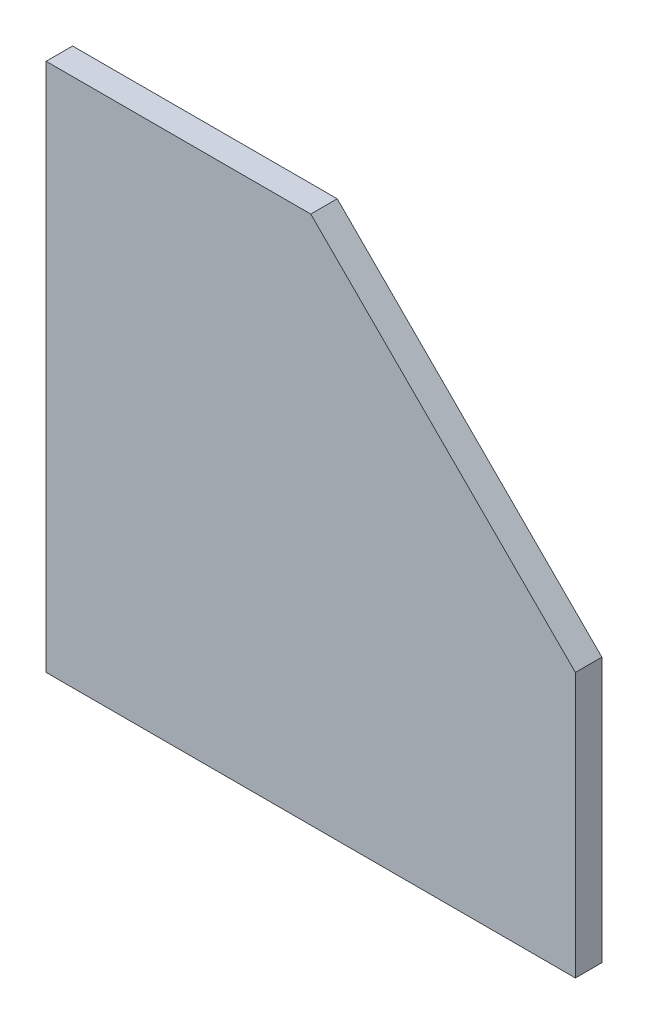
ISO-10303-21;
HEADER;
FILE_DESCRIPTION(('STEP AP214'),'2;1');
FILE_NAME('part.step','',(''),(''),'','','');
FILE_SCHEMA(('AUTOMOTIVE_DESIGN { 1 0 10303 214 1 1 1 1 }'));
ENDSEC;
DATA;
#1=APPLICATION_CONTEXT('core data for automotive mechanical design processes');
#2=APPLICATION_PROTOCOL_DEFINITION('international standard','automotive_design',2000,#1);
#3=PRODUCT_CONTEXT('',#1,'mechanical');
#4=PRODUCT('Part','Part','',(#3));
#5=PRODUCT_RELATED_PRODUCT_CATEGORY('part','',(#4));
#6=PRODUCT_DEFINITION_FORMATION('','',#4);
#7=PRODUCT_DEFINITION_CONTEXT('part definition',#1,'design');
#8=PRODUCT_DEFINITION('design','',#6,#7);
#9=PRODUCT_DEFINITION_SHAPE('','',#8);
#10=(LENGTH_UNIT() NAMED_UNIT(*) SI_UNIT(.MILLI.,.METRE.));
#11=(NAMED_UNIT(*) PLANE_ANGLE_UNIT() SI_UNIT($,.RADIAN.));
#12=(NAMED_UNIT(*) SI_UNIT($,.STERADIAN.) SOLID_ANGLE_UNIT());
#13=UNCERTAINTY_MEASURE_WITH_UNIT(LENGTH_MEASURE(1.E-05),#10,'distance_accuracy_value','');
#14=(GEOMETRIC_REPRESENTATION_CONTEXT(3) GLOBAL_UNCERTAINTY_ASSIGNED_CONTEXT((#13)) GLOBAL_UNIT_ASSIGNED_CONTEXT((#10,
#11,#12)) REPRESENTATION_CONTEXT('',''));
#15=CARTESIAN_POINT('',(0.,0.,0.));
#16=DIRECTION('',(0.,0.,1.));
#17=DIRECTION('',(1.,0.,0.));
#18=AXIS2_PLACEMENT_3D('',#15,#16,#17);
#19=CARTESIAN_POINT('',(-568.48934761149,-611.90552333629,-812.486147986318));
#20=DIRECTION('',(0.,0.,-1.));
#21=DIRECTION('',(-1.,0.,0.));
#22=AXIS2_PLACEMENT_3D('',#19,#20,#21);
#23=PLANE('',#22);
#24=DIRECTION('',(0.,1.,0.));
#25=VECTOR('',#24,1.);
#26=CARTESIAN_POINT('',(-628.489347611488,-611.90552333629,-812.486147986318));
#27=LINE('',#26,#25);
#28=CARTESIAN_POINT('',(-628.489347611488,-551.905523336291,-812.486147986318));
#29=VERTEX_POINT('',#28);
#30=CARTESIAN_POINT('',(-628.489347611488,-671.905523336291,-812.486147986318));
#31=VERTEX_POINT('',#30);
#32=EDGE_CURVE('E91',#29,#31,#27,.F.);
#33=ORIENTED_EDGE('',*,*,#32,.F.);
#34=DIRECTION('',(1.,0.,0.));
#35=VECTOR('',#34,1.);
#36=CARTESIAN_POINT('',(-568.48934761149,-551.905523336291,-812.486147986318));
#37=LINE('',#36,#35);
#38=CARTESIAN_POINT('',(-568.489347611487,-551.905523336291,-812.486147986318));
#39=VERTEX_POINT('',#38);
#40=EDGE_CURVE('E94',#39,#29,#37,.F.);
#41=ORIENTED_EDGE('',*,*,#40,.F.);
#42=DIRECTION('',(0.707106781186548,-0.707106781186548,0.));
#43=VECTOR('',#42,1.);
#44=CARTESIAN_POINT('',(-538.489347611488,-581.90552333629,-812.486147986318));
#45=LINE('',#44,#43);
#46=CARTESIAN_POINT('',(-508.489347611488,-611.90552333629,-812.486147986318));
#47=VERTEX_POINT('',#46);
#48=EDGE_CURVE('E66',#39,#47,#45,.T.);
#49=ORIENTED_EDGE('',*,*,#48,.T.);
#50=DIRECTION('',(0.,1.,0.));
#51=VECTOR('',#50,1.);
#52=CARTESIAN_POINT('',(-508.489347611488,-611.90552333629,-812.486147986318));
#53=LINE('',#52,#51);
#54=CARTESIAN_POINT('',(-508.489347611488,-671.905523336291,-812.486147986318));
#55=VERTEX_POINT('',#54);
#56=EDGE_CURVE('E20',#55,#47,#53,.T.);
#57=ORIENTED_EDGE('',*,*,#56,.F.);
#58=DIRECTION('',(1.,0.,0.));
#59=VECTOR('',#58,1.);
#60=CARTESIAN_POINT('',(-568.48934761149,-671.905523336291,-812.486147986318));
#61=LINE('',#60,#59);
#62=EDGE_CURVE('E63',#31,#55,#61,.T.);
#63=ORIENTED_EDGE('',*,*,#62,.F.);
#64=EDGE_LOOP('',(#33,#41,#49,#57,#63));
#65=FACE_BOUND('',#64,.T.);
#66=ADVANCED_FACE('F17',(#65),#23,.T.);
#67=CARTESIAN_POINT('',(-508.489347611488,-611.90552333629,-809.486147986318));
#68=DIRECTION('',(1.,0.,0.));
#69=DIRECTION('',(0.,0.,-1.));
#70=AXIS2_PLACEMENT_3D('',#67,#68,#69);
#71=PLANE('',#70);
#72=DIRECTION('',(0.,0.,-1.));
#73=VECTOR('',#72,1.);
#74=CARTESIAN_POINT('',(-508.489347611488,-671.905523336291,-809.486147986318));
#75=LINE('',#74,#73);
#76=CARTESIAN_POINT('',(-508.489347611488,-671.905523336291,-806.48614798632));
#77=VERTEX_POINT('',#76);
#78=EDGE_CURVE('E72',#55,#77,#75,.F.);
#79=ORIENTED_EDGE('',*,*,#78,.F.);
#80=ORIENTED_EDGE('',*,*,#56,.T.);
#81=DIRECTION('',(0.,0.,1.));
#82=VECTOR('',#81,1.);
#83=CARTESIAN_POINT('',(-508.489347611488,-611.90552333629,-809.486147986318));
#84=LINE('',#83,#82);
#85=CARTESIAN_POINT('',(-508.489347611488,-611.90552333629,-806.48614798632));
#86=VERTEX_POINT('',#85);
#87=EDGE_CURVE('E100',#47,#86,#84,.T.);
#88=ORIENTED_EDGE('',*,*,#87,.T.);
#89=DIRECTION('',(0.,1.,0.));
#90=VECTOR('',#89,1.);
#91=CARTESIAN_POINT('',(-508.489347611488,-611.90552333629,-806.48614798632));
#92=LINE('',#91,#90);
#93=EDGE_CURVE('E83',#86,#77,#92,.F.);
#94=ORIENTED_EDGE('',*,*,#93,.T.);
#95=EDGE_LOOP('',(#79,#80,#88,#94));
#96=FACE_BOUND('',#95,.T.);
#97=ADVANCED_FACE('F82',(#96),#71,.T.);
#98=CARTESIAN_POINT('',(-568.48934761149,-671.905523336291,-809.486147986318));
#99=DIRECTION('',(0.,-1.,0.));
#100=DIRECTION('',(0.,0.,-1.));
#101=AXIS2_PLACEMENT_3D('',#98,#99,#100);
#102=PLANE('',#101);
#103=DIRECTION('',(0.,0.,1.));
#104=VECTOR('',#103,1.);
#105=CARTESIAN_POINT('',(-628.489347611488,-671.905523336291,-809.486147986318));
#106=LINE('',#105,#104);
#107=CARTESIAN_POINT('',(-628.489347611488,-671.905523336291,-806.48614798632));
#108=VERTEX_POINT('',#107);
#109=EDGE_CURVE('E78',#31,#108,#106,.T.);
#110=ORIENTED_EDGE('',*,*,#109,.F.);
#111=ORIENTED_EDGE('',*,*,#62,.T.);
#112=ORIENTED_EDGE('',*,*,#78,.T.);
#113=DIRECTION('',(-1.,0.,0.));
#114=VECTOR('',#113,1.);
#115=CARTESIAN_POINT('',(-568.48934761149,-671.905523336291,-806.48614798632));
#116=LINE('',#115,#114);
#117=EDGE_CURVE('E107',#77,#108,#116,.T.);
#118=ORIENTED_EDGE('',*,*,#117,.T.);
#119=EDGE_LOOP('',(#110,#111,#112,#118));
#120=FACE_BOUND('',#119,.T.);
#121=ADVANCED_FACE('F75',(#120),#102,.T.);
#122=CARTESIAN_POINT('',(-628.489347611488,-611.90552333629,-809.486147986318));
#123=DIRECTION('',(-1.,0.,0.));
#124=DIRECTION('',(0.,0.,1.));
#125=AXIS2_PLACEMENT_3D('',#122,#123,#124);
#126=PLANE('',#125);
#127=DIRECTION('',(0.,0.,1.));
#128=VECTOR('',#127,1.);
#129=CARTESIAN_POINT('',(-628.489347611488,-551.905523336291,-809.486147986318));
#130=LINE('',#129,#128);
#131=CARTESIAN_POINT('',(-628.489347611488,-551.905523336291,-806.48614798632));
#132=VERTEX_POINT('',#131);
#133=EDGE_CURVE('E97',#29,#132,#130,.T.);
#134=ORIENTED_EDGE('',*,*,#133,.F.);
#135=ORIENTED_EDGE('',*,*,#32,.T.);
#136=ORIENTED_EDGE('',*,*,#109,.T.);
#137=DIRECTION('',(0.,1.,0.));
#138=VECTOR('',#137,1.);
#139=CARTESIAN_POINT('',(-628.489347611488,-611.90552333629,-806.48614798632));
#140=LINE('',#139,#138);
#141=EDGE_CURVE('E110',#108,#132,#140,.T.);
#142=ORIENTED_EDGE('',*,*,#141,.T.);
#143=EDGE_LOOP('',(#134,#135,#136,#142));
#144=FACE_BOUND('',#143,.T.);
#145=ADVANCED_FACE('F124',(#144),#126,.T.);
#146=CARTESIAN_POINT('',(-568.48934761149,-551.905523336291,-809.486147986318));
#147=DIRECTION('',(0.,1.,0.));
#148=DIRECTION('',(0.,0.,1.));
#149=AXIS2_PLACEMENT_3D('',#146,#147,#148);
#150=PLANE('',#149);
#151=ORIENTED_EDGE('',*,*,#133,.T.);
#152=DIRECTION('',(-1.,0.,0.));
#153=VECTOR('',#152,1.);
#154=CARTESIAN_POINT('',(-568.48934761149,-551.905523336291,-806.48614798632));
#155=LINE('',#154,#153);
#156=CARTESIAN_POINT('',(-568.489347611487,-551.905523336291,-806.48614798632));
#157=VERTEX_POINT('',#156);
#158=EDGE_CURVE('E27',#132,#157,#155,.F.);
#159=ORIENTED_EDGE('',*,*,#158,.T.);
#160=DIRECTION('',(0.,0.,1.));
#161=VECTOR('',#160,1.);
#162=CARTESIAN_POINT('',(-568.489347611487,-551.905523336291,-809.486147986318));
#163=LINE('',#162,#161);
#164=EDGE_CURVE('E35',#157,#39,#163,.F.);
#165=ORIENTED_EDGE('',*,*,#164,.T.);
#166=ORIENTED_EDGE('',*,*,#40,.T.);
#167=EDGE_LOOP('',(#151,#159,#165,#166));
#168=FACE_BOUND('',#167,.T.);
#169=ADVANCED_FACE('F118',(#168),#150,.T.);
#170=CARTESIAN_POINT('',(-538.489347611488,-581.90552333629,-809.486147986318));
#171=DIRECTION('',(-0.707106781186548,-0.707106781186548,0.));
#172=DIRECTION('',(0.707106781186548,-0.707106781186548,0.));
#173=AXIS2_PLACEMENT_3D('',#170,#171,#172);
#174=PLANE('',#173);
#175=ORIENTED_EDGE('',*,*,#164,.F.);
#176=DIRECTION('',(0.707106781186548,-0.707106781186547,0.));
#177=VECTOR('',#176,1.);
#178=CARTESIAN_POINT('',(-568.489347611487,-551.905523336291,-806.48614798632));
#179=LINE('',#178,#177);
#180=EDGE_CURVE('E11',#157,#86,#179,.T.);
#181=ORIENTED_EDGE('',*,*,#180,.T.);
#182=ORIENTED_EDGE('',*,*,#87,.F.);
#183=ORIENTED_EDGE('',*,*,#48,.F.);
#184=EDGE_LOOP('',(#175,#181,#182,#183));
#185=FACE_BOUND('',#184,.T.);
#186=ADVANCED_FACE('F125',(#185),#174,.F.);
#187=CARTESIAN_POINT('',(-568.48934761149,-611.90552333629,-806.48614798632));
#188=DIRECTION('',(0.,0.,-1.));
#189=DIRECTION('',(-1.,0.,0.));
#190=AXIS2_PLACEMENT_3D('',#187,#188,#189);
#191=PLANE('',#190);
#192=ORIENTED_EDGE('',*,*,#158,.F.);
#193=ORIENTED_EDGE('',*,*,#141,.F.);
#194=ORIENTED_EDGE('',*,*,#117,.F.);
#195=ORIENTED_EDGE('',*,*,#93,.F.);
#196=ORIENTED_EDGE('',*,*,#180,.F.);
#197=EDGE_LOOP('',(#192,#193,#194,#195,#196));
#198=FACE_BOUND('',#197,.T.);
#199=ADVANCED_FACE('F122',(#198),#191,.F.);
#200=CLOSED_SHELL('',(#66,#97,#121,#145,#169,#186,#199));
#201=MANIFOLD_SOLID_BREP('B1',#200);
#202=ADVANCED_BREP_SHAPE_REPRESENTATION('',(#18,#201),#14);
#203=SHAPE_DEFINITION_REPRESENTATION(#9,#202);
ENDSEC;
END-ISO-10303-21;
